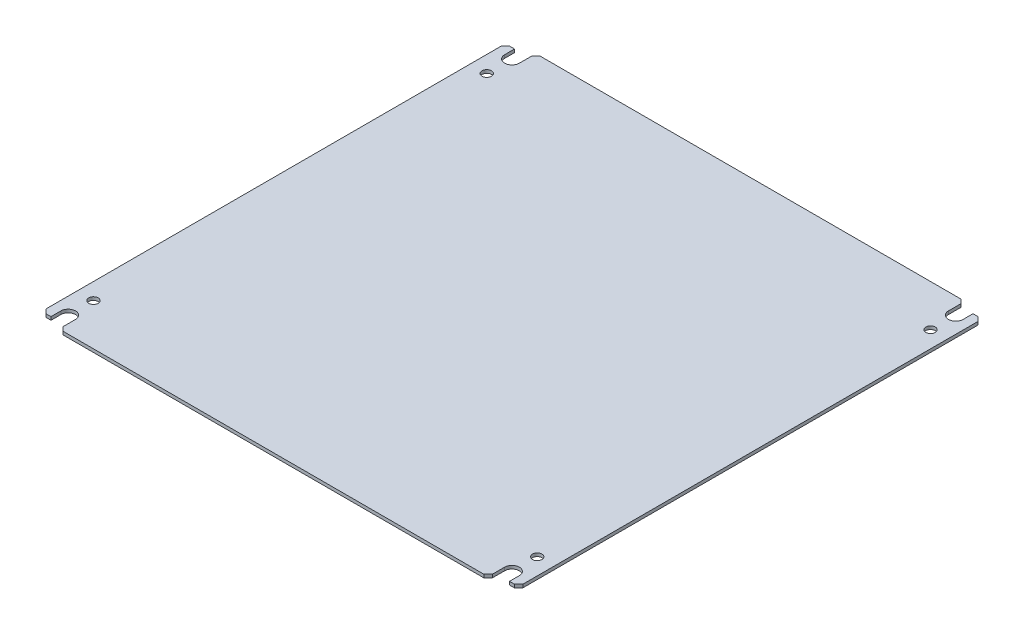
ISO-10303-21;
HEADER;
FILE_DESCRIPTION(('STEP AP214'),'2;1');
FILE_NAME('part.step','',(''),(''),'','','');
FILE_SCHEMA(('AUTOMOTIVE_DESIGN { 1 0 10303 214 1 1 1 1 }'));
ENDSEC;
DATA;
#1=APPLICATION_CONTEXT('core data for automotive mechanical design processes');
#2=APPLICATION_PROTOCOL_DEFINITION('international standard','automotive_design',2000,#1);
#3=PRODUCT_CONTEXT('',#1,'mechanical');
#4=PRODUCT('Part','Part','',(#3));
#5=PRODUCT_RELATED_PRODUCT_CATEGORY('part','',(#4));
#6=PRODUCT_DEFINITION_FORMATION('','',#4);
#7=PRODUCT_DEFINITION_CONTEXT('part definition',#1,'design');
#8=PRODUCT_DEFINITION('design','',#6,#7);
#9=PRODUCT_DEFINITION_SHAPE('','',#8);
#10=(LENGTH_UNIT() NAMED_UNIT(*) SI_UNIT(.MILLI.,.METRE.));
#11=(NAMED_UNIT(*) PLANE_ANGLE_UNIT() SI_UNIT($,.RADIAN.));
#12=(NAMED_UNIT(*) SI_UNIT($,.STERADIAN.) SOLID_ANGLE_UNIT());
#13=UNCERTAINTY_MEASURE_WITH_UNIT(LENGTH_MEASURE(1.E-05),#10,'distance_accuracy_value','');
#14=(GEOMETRIC_REPRESENTATION_CONTEXT(3) GLOBAL_UNCERTAINTY_ASSIGNED_CONTEXT((#13)) GLOBAL_UNIT_ASSIGNED_CONTEXT((#10,
#11,#12)) REPRESENTATION_CONTEXT('',''));
#15=CARTESIAN_POINT('',(0.,0.,0.));
#16=DIRECTION('',(0.,0.,1.));
#17=DIRECTION('',(1.,0.,0.));
#18=AXIS2_PLACEMENT_3D('',#15,#16,#17);
#19=CARTESIAN_POINT('',(-179.959,0.,-179.959));
#20=DIRECTION('',(0.,-1.,0.));
#21=DIRECTION('',(0.,0.,-1.));
#22=AXIS2_PLACEMENT_3D('',#19,#20,#21);
#23=PLANE('',#22);
#24=DIRECTION('',(0.,0.,-1.));
#25=VECTOR('',#24,1.);
#26=CARTESIAN_POINT('',(-173.0375,0.,-167.4876));
#27=LINE('',#26,#25);
#28=CARTESIAN_POINT('',(-173.0375,0.,-167.4876));
#29=VERTEX_POINT('',#28);
#30=CARTESIAN_POINT('',(-173.0375,0.,-174.9552));
#31=VERTEX_POINT('',#30);
#32=EDGE_CURVE('E274',#29,#31,#27,.T.);
#33=ORIENTED_EDGE('',*,*,#32,.F.);
#34=CARTESIAN_POINT('',(-167.4876,0.,-167.4876));
#35=DIRECTION('',(0.,1.,0.));
#36=DIRECTION('',(0.,0.,1.));
#37=AXIS2_PLACEMENT_3D('',#34,#35,#36);
#38=CIRCLE('',#37,5.5499);
#39=CARTESIAN_POINT('',(-161.9377,0.,-167.4876));
#40=VERTEX_POINT('',#39);
#41=EDGE_CURVE('E264',#29,#40,#38,.T.);
#42=ORIENTED_EDGE('',*,*,#41,.T.);
#43=DIRECTION('',(0.,0.,1.));
#44=VECTOR('',#43,1.);
#45=CARTESIAN_POINT('',(-161.9377,0.,-167.4876));
#46=LINE('',#45,#44);
#47=CARTESIAN_POINT('',(-161.9377,0.,-176.784));
#48=VERTEX_POINT('',#47);
#49=EDGE_CURVE('E261',#48,#40,#46,.T.);
#50=ORIENTED_EDGE('',*,*,#49,.F.);
#51=DIRECTION('',(-0.707106781186545,0.,0.70710678118655));
#52=VECTOR('',#51,1.);
#53=CARTESIAN_POINT('',(-161.9377,0.,-176.784));
#54=LINE('',#53,#52);
#55=CARTESIAN_POINT('',(-158.7627,0.,-179.959));
#56=VERTEX_POINT('',#55);
#57=EDGE_CURVE('E267',#56,#48,#54,.T.);
#58=ORIENTED_EDGE('',*,*,#57,.F.);
#59=DIRECTION('',(1.,0.,0.));
#60=VECTOR('',#59,1.);
#61=CARTESIAN_POINT('',(179.959,0.,-179.959));
#62=LINE('',#61,#60);
#63=CARTESIAN_POINT('',(158.7627,0.,-179.959));
#64=VERTEX_POINT('',#63);
#65=EDGE_CURVE('E255',#56,#64,#62,.T.);
#66=ORIENTED_EDGE('',*,*,#65,.T.);
#67=DIRECTION('',(-0.707106781186545,0.,-0.70710678118655));
#68=VECTOR('',#67,1.);
#69=CARTESIAN_POINT('',(158.7627,0.,-179.959));
#70=LINE('',#69,#68);
#71=CARTESIAN_POINT('',(161.9377,0.,-176.784));
#72=VERTEX_POINT('',#71);
#73=EDGE_CURVE('E250',#72,#64,#70,.T.);
#74=ORIENTED_EDGE('',*,*,#73,.F.);
#75=DIRECTION('',(0.,0.,-1.));
#76=VECTOR('',#75,1.);
#77=CARTESIAN_POINT('',(161.9377,0.,-179.959));
#78=LINE('',#77,#76);
#79=CARTESIAN_POINT('',(161.9377,0.,-167.4876));
#80=VERTEX_POINT('',#79);
#81=EDGE_CURVE('E198',#80,#72,#78,.T.);
#82=ORIENTED_EDGE('',*,*,#81,.F.);
#83=CARTESIAN_POINT('',(167.4876,0.,-167.4876));
#84=DIRECTION('',(0.,1.,0.));
#85=DIRECTION('',(0.,0.,1.));
#86=AXIS2_PLACEMENT_3D('',#83,#84,#85);
#87=CIRCLE('',#86,5.5499);
#88=CARTESIAN_POINT('',(173.0375,0.,-167.4876));
#89=VERTEX_POINT('',#88);
#90=EDGE_CURVE('E212',#80,#89,#87,.T.);
#91=ORIENTED_EDGE('',*,*,#90,.T.);
#92=DIRECTION('',(0.,0.,1.));
#93=VECTOR('',#92,1.);
#94=CARTESIAN_POINT('',(173.0375,0.,-167.4876));
#95=LINE('',#94,#93);
#96=CARTESIAN_POINT('',(173.0375,0.,-174.9552));
#97=VERTEX_POINT('',#96);
#98=EDGE_CURVE('E204',#97,#89,#95,.T.);
#99=ORIENTED_EDGE('',*,*,#98,.F.);
#100=DIRECTION('',(-1.,0.,0.));
#101=VECTOR('',#100,1.);
#102=CARTESIAN_POINT('',(173.0375,0.,-174.9552));
#103=LINE('',#102,#101);
#104=CARTESIAN_POINT('',(176.784,-2.59052039079203E-13,-174.9552));
#105=VERTEX_POINT('',#104);
#106=EDGE_CURVE('E223',#105,#97,#103,.T.);
#107=ORIENTED_EDGE('',*,*,#106,.F.);
#108=DIRECTION('',(-0.707106781186548,0.,-0.707106781186548));
#109=VECTOR('',#108,1.);
#110=CARTESIAN_POINT('',(176.784,-2.22044604925031E-13,-174.9552));
#111=LINE('',#110,#109);
#112=CARTESIAN_POINT('',(179.959,0.,-171.7802));
#113=VERTEX_POINT('',#112);
#114=EDGE_CURVE('E359',#113,#105,#111,.T.);
#115=ORIENTED_EDGE('',*,*,#114,.F.);
#116=DIRECTION('',(0.,0.,1.));
#117=VECTOR('',#116,1.);
#118=CARTESIAN_POINT('',(179.959,0.,179.959));
#119=LINE('',#118,#117);
#120=CARTESIAN_POINT('',(179.959,0.,171.7802));
#121=VERTEX_POINT('',#120);
#122=EDGE_CURVE('E351',#113,#121,#119,.T.);
#123=ORIENTED_EDGE('',*,*,#122,.T.);
#124=DIRECTION('',(0.707106781186548,0.,-0.707106781186548));
#125=VECTOR('',#124,1.);
#126=CARTESIAN_POINT('',(179.959,0.,171.7802));
#127=LINE('',#126,#125);
#128=CARTESIAN_POINT('',(176.784,0.,174.9552));
#129=VERTEX_POINT('',#128);
#130=EDGE_CURVE('E349',#129,#121,#127,.T.);
#131=ORIENTED_EDGE('',*,*,#130,.F.);
#132=DIRECTION('',(1.,0.,0.));
#133=VECTOR('',#132,1.);
#134=CARTESIAN_POINT('',(179.959,0.,174.9552));
#135=LINE('',#134,#133);
#136=CARTESIAN_POINT('',(173.0375,0.,174.9552));
#137=VERTEX_POINT('',#136);
#138=EDGE_CURVE('E344',#137,#129,#135,.T.);
#139=ORIENTED_EDGE('',*,*,#138,.F.);
#140=DIRECTION('',(0.,0.,1.));
#141=VECTOR('',#140,1.);
#142=CARTESIAN_POINT('',(173.0375,0.,174.9552));
#143=LINE('',#142,#141);
#144=CARTESIAN_POINT('',(173.0375,0.,167.4876));
#145=VERTEX_POINT('',#144);
#146=EDGE_CURVE('E338',#145,#137,#143,.T.);
#147=ORIENTED_EDGE('',*,*,#146,.F.);
#148=CARTESIAN_POINT('',(167.4876,0.,167.4876));
#149=DIRECTION('',(0.,1.,0.));
#150=DIRECTION('',(0.,0.,1.));
#151=AXIS2_PLACEMENT_3D('',#148,#149,#150);
#152=CIRCLE('',#151,5.5499);
#153=CARTESIAN_POINT('',(161.9377,0.,167.4876));
#154=VERTEX_POINT('',#153);
#155=EDGE_CURVE('E335',#145,#154,#152,.T.);
#156=ORIENTED_EDGE('',*,*,#155,.T.);
#157=DIRECTION('',(0.,0.,-1.));
#158=VECTOR('',#157,1.);
#159=CARTESIAN_POINT('',(161.9377,0.,167.4876));
#160=LINE('',#159,#158);
#161=CARTESIAN_POINT('',(161.9377,0.,176.784));
#162=VERTEX_POINT('',#161);
#163=EDGE_CURVE('E333',#162,#154,#160,.T.);
#164=ORIENTED_EDGE('',*,*,#163,.F.);
#165=DIRECTION('',(0.707106781186545,0.,-0.70710678118655));
#166=VECTOR('',#165,1.);
#167=CARTESIAN_POINT('',(161.9377,0.,176.784));
#168=LINE('',#167,#166);
#169=CARTESIAN_POINT('',(158.7627,0.,179.959));
#170=VERTEX_POINT('',#169);
#171=EDGE_CURVE('E327',#170,#162,#168,.T.);
#172=ORIENTED_EDGE('',*,*,#171,.F.);
#173=DIRECTION('',(-1.,0.,0.));
#174=VECTOR('',#173,1.);
#175=CARTESIAN_POINT('',(-179.959,0.,179.959));
#176=LINE('',#175,#174);
#177=CARTESIAN_POINT('',(-158.7627,0.,179.959));
#178=VERTEX_POINT('',#177);
#179=EDGE_CURVE('E319',#170,#178,#176,.T.);
#180=ORIENTED_EDGE('',*,*,#179,.T.);
#181=DIRECTION('',(0.707106781186545,0.,0.70710678118655));
#182=VECTOR('',#181,1.);
#183=CARTESIAN_POINT('',(-158.7627,0.,179.959));
#184=LINE('',#183,#182);
#185=CARTESIAN_POINT('',(-161.9377,0.,176.784));
#186=VERTEX_POINT('',#185);
#187=EDGE_CURVE('E317',#186,#178,#184,.T.);
#188=ORIENTED_EDGE('',*,*,#187,.F.);
#189=DIRECTION('',(0.,0.,1.));
#190=VECTOR('',#189,1.);
#191=CARTESIAN_POINT('',(-161.9377,0.,179.959));
#192=LINE('',#191,#190);
#193=CARTESIAN_POINT('',(-161.9377,0.,167.4876));
#194=VERTEX_POINT('',#193);
#195=EDGE_CURVE('E311',#194,#186,#192,.T.);
#196=ORIENTED_EDGE('',*,*,#195,.F.);
#197=CARTESIAN_POINT('',(-167.4876,0.,167.4876));
#198=DIRECTION('',(0.,1.,0.));
#199=DIRECTION('',(0.,0.,1.));
#200=AXIS2_PLACEMENT_3D('',#197,#198,#199);
#201=CIRCLE('',#200,5.5499);
#202=CARTESIAN_POINT('',(-173.0375,0.,167.4876));
#203=VERTEX_POINT('',#202);
#204=EDGE_CURVE('E308',#194,#203,#201,.T.);
#205=ORIENTED_EDGE('',*,*,#204,.T.);
#206=DIRECTION('',(0.,0.,-1.));
#207=VECTOR('',#206,1.);
#208=CARTESIAN_POINT('',(-173.0375,0.,167.4876));
#209=LINE('',#208,#207);
#210=CARTESIAN_POINT('',(-173.0375,0.,174.9552));
#211=VERTEX_POINT('',#210);
#212=EDGE_CURVE('E306',#211,#203,#209,.T.);
#213=ORIENTED_EDGE('',*,*,#212,.F.);
#214=DIRECTION('',(1.,0.,0.));
#215=VECTOR('',#214,1.);
#216=CARTESIAN_POINT('',(-173.0375,0.,174.9552));
#217=LINE('',#216,#215);
#218=CARTESIAN_POINT('',(-176.784,-2.59052039079203E-13,174.9552));
#219=VERTEX_POINT('',#218);
#220=EDGE_CURVE('E301',#219,#211,#217,.T.);
#221=ORIENTED_EDGE('',*,*,#220,.F.);
#222=DIRECTION('',(0.707106781186548,0.,0.707106781186548));
#223=VECTOR('',#222,1.);
#224=CARTESIAN_POINT('',(-176.784,-2.22044604925031E-13,174.9552));
#225=LINE('',#224,#223);
#226=CARTESIAN_POINT('',(-179.959,0.,171.7802));
#227=VERTEX_POINT('',#226);
#228=EDGE_CURVE('E295',#227,#219,#225,.T.);
#229=ORIENTED_EDGE('',*,*,#228,.F.);
#230=DIRECTION('',(0.,0.,-1.));
#231=VECTOR('',#230,1.);
#232=CARTESIAN_POINT('',(-179.959,0.,-179.959));
#233=LINE('',#232,#231);
#234=CARTESIAN_POINT('',(-179.959,0.,-171.7802));
#235=VERTEX_POINT('',#234);
#236=EDGE_CURVE('E287',#227,#235,#233,.T.);
#237=ORIENTED_EDGE('',*,*,#236,.T.);
#238=DIRECTION('',(-0.707106781186548,0.,0.707106781186548));
#239=VECTOR('',#238,1.);
#240=CARTESIAN_POINT('',(-179.959,0.,-171.7802));
#241=LINE('',#240,#239);
#242=CARTESIAN_POINT('',(-176.784,0.,-174.9552));
#243=VERTEX_POINT('',#242);
#244=EDGE_CURVE('E285',#243,#235,#241,.T.);
#245=ORIENTED_EDGE('',*,*,#244,.F.);
#246=DIRECTION('',(-1.,0.,0.));
#247=VECTOR('',#246,1.);
#248=CARTESIAN_POINT('',(-173.0375,0.,-174.9552));
#249=LINE('',#248,#247);
#250=EDGE_CURVE('E280',#31,#243,#249,.T.);
#251=ORIENTED_EDGE('',*,*,#250,.F.);
#252=EDGE_LOOP('',(#33,#42,#50,#58,#66,#74,#82,#91,#99,#107,#115,#123,#131,#139,#147,#156,#164,
#172,#180,#188,#196,#205,#213,#221,#229,#237,#245,#251));
#253=FACE_BOUND('',#252,.T.);
#254=CARTESIAN_POINT('',(-167.4876,0.,148.4376));
#255=DIRECTION('',(0.,-1.,0.));
#256=DIRECTION('',(0.,0.,-1.));
#257=AXIS2_PLACEMENT_3D('',#254,#255,#256);
#258=CIRCLE('',#257,3.5687);
#259=CARTESIAN_POINT('',(-167.4876,0.,144.8689));
#260=VERTEX_POINT('',#259);
#261=EDGE_CURVE('E252',#260,#260,#258,.F.);
#262=ORIENTED_EDGE('',*,*,#261,.T.);
#263=EDGE_LOOP('',(#262));
#264=FACE_BOUND('',#263,.T.);
#265=CARTESIAN_POINT('',(-167.4876,0.,-148.4376));
#266=DIRECTION('',(0.,-1.,0.));
#267=DIRECTION('',(0.,0.,-1.));
#268=AXIS2_PLACEMENT_3D('',#265,#266,#267);
#269=CIRCLE('',#268,3.5687);
#270=CARTESIAN_POINT('',(-167.4876,0.,-152.0063));
#271=VERTEX_POINT('',#270);
#272=EDGE_CURVE('E409',#271,#271,#269,.F.);
#273=ORIENTED_EDGE('',*,*,#272,.T.);
#274=EDGE_LOOP('',(#273));
#275=FACE_BOUND('',#274,.T.);
#276=CARTESIAN_POINT('',(167.4876,0.,-148.4376));
#277=DIRECTION('',(0.,-1.,0.));
#278=DIRECTION('',(0.,0.,-1.));
#279=AXIS2_PLACEMENT_3D('',#276,#277,#278);
#280=CIRCLE('',#279,3.5687);
#281=CARTESIAN_POINT('',(167.4876,0.,-152.0063));
#282=VERTEX_POINT('',#281);
#283=EDGE_CURVE('E411',#282,#282,#280,.F.);
#284=ORIENTED_EDGE('',*,*,#283,.T.);
#285=EDGE_LOOP('',(#284));
#286=FACE_BOUND('',#285,.T.);
#287=CARTESIAN_POINT('',(167.4876,0.,148.4376));
#288=DIRECTION('',(0.,-1.,0.));
#289=DIRECTION('',(0.,0.,-1.));
#290=AXIS2_PLACEMENT_3D('',#287,#288,#289);
#291=CIRCLE('',#290,3.5687);
#292=CARTESIAN_POINT('',(167.4876,0.,144.8689));
#293=VERTEX_POINT('',#292);
#294=EDGE_CURVE('E19',#293,#293,#291,.F.);
#295=ORIENTED_EDGE('',*,*,#294,.T.);
#296=EDGE_LOOP('',(#295));
#297=FACE_BOUND('',#296,.T.);
#298=ADVANCED_FACE('F16',(#253,#264,#275,#286,#297),#23,.T.);
#299=CARTESIAN_POINT('',(167.4876,0.,148.4376));
#300=DIRECTION('',(0.,-1.,0.));
#301=DIRECTION('',(0.,0.,-1.));
#302=AXIS2_PLACEMENT_3D('',#299,#300,#301);
#303=CYLINDRICAL_SURFACE('',#302,3.5687);
#304=CARTESIAN_POINT('',(167.4876,2.413,148.4376));
#305=DIRECTION('',(0.,-1.,0.));
#306=DIRECTION('',(0.,0.,-1.));
#307=AXIS2_PLACEMENT_3D('',#304,#305,#306);
#308=CIRCLE('',#307,3.5687);
#309=CARTESIAN_POINT('',(167.4876,2.413,144.8689));
#310=VERTEX_POINT('',#309);
#311=EDGE_CURVE('E258',#310,#310,#308,.F.);
#312=ORIENTED_EDGE('',*,*,#311,.T.);
#313=EDGE_LOOP('',(#312));
#314=FACE_BOUND('',#313,.T.);
#315=ORIENTED_EDGE('',*,*,#294,.F.);
#316=EDGE_LOOP('',(#315));
#317=FACE_BOUND('',#316,.T.);
#318=ADVANCED_FACE('F419',(#314,#317),#303,.F.);
#319=CARTESIAN_POINT('',(167.4876,0.,-148.4376));
#320=DIRECTION('',(0.,-1.,0.));
#321=DIRECTION('',(0.,0.,-1.));
#322=AXIS2_PLACEMENT_3D('',#319,#320,#321);
#323=CYLINDRICAL_SURFACE('',#322,3.5687);
#324=CARTESIAN_POINT('',(167.4876,2.413,-148.4376));
#325=DIRECTION('',(0.,-1.,0.));
#326=DIRECTION('',(0.,0.,-1.));
#327=AXIS2_PLACEMENT_3D('',#324,#325,#326);
#328=CIRCLE('',#327,3.5687);
#329=CARTESIAN_POINT('',(167.4876,2.413,-152.0063));
#330=VERTEX_POINT('',#329);
#331=EDGE_CURVE('E393',#330,#330,#328,.F.);
#332=ORIENTED_EDGE('',*,*,#331,.T.);
#333=EDGE_LOOP('',(#332));
#334=FACE_BOUND('',#333,.T.);
#335=ORIENTED_EDGE('',*,*,#283,.F.);
#336=EDGE_LOOP('',(#335));
#337=FACE_BOUND('',#336,.T.);
#338=ADVANCED_FACE('F421',(#334,#337),#323,.F.);
#339=CARTESIAN_POINT('',(-167.4876,0.,-148.4376));
#340=DIRECTION('',(0.,-1.,0.));
#341=DIRECTION('',(0.,0.,-1.));
#342=AXIS2_PLACEMENT_3D('',#339,#340,#341);
#343=CYLINDRICAL_SURFACE('',#342,3.5687);
#344=CARTESIAN_POINT('',(-167.4876,2.413,-148.4376));
#345=DIRECTION('',(0.,-1.,0.));
#346=DIRECTION('',(0.,0.,-1.));
#347=AXIS2_PLACEMENT_3D('',#344,#345,#346);
#348=CIRCLE('',#347,3.5687);
#349=CARTESIAN_POINT('',(-167.4876,2.413,-152.0063));
#350=VERTEX_POINT('',#349);
#351=EDGE_CURVE('E390',#350,#350,#348,.F.);
#352=ORIENTED_EDGE('',*,*,#351,.T.);
#353=EDGE_LOOP('',(#352));
#354=FACE_BOUND('',#353,.T.);
#355=ORIENTED_EDGE('',*,*,#272,.F.);
#356=EDGE_LOOP('',(#355));
#357=FACE_BOUND('',#356,.T.);
#358=ADVANCED_FACE('F428',(#354,#357),#343,.F.);
#359=CARTESIAN_POINT('',(-167.4876,0.,148.4376));
#360=DIRECTION('',(0.,-1.,0.));
#361=DIRECTION('',(0.,0.,-1.));
#362=AXIS2_PLACEMENT_3D('',#359,#360,#361);
#363=CYLINDRICAL_SURFACE('',#362,3.5687);
#364=CARTESIAN_POINT('',(-167.4876,2.413,148.4376));
#365=DIRECTION('',(0.,-1.,0.));
#366=DIRECTION('',(0.,0.,-1.));
#367=AXIS2_PLACEMENT_3D('',#364,#365,#366);
#368=CIRCLE('',#367,3.5687);
#369=CARTESIAN_POINT('',(-167.4876,2.413,144.8689));
#370=VERTEX_POINT('',#369);
#371=EDGE_CURVE('E239',#370,#370,#368,.F.);
#372=ORIENTED_EDGE('',*,*,#371,.T.);
#373=EDGE_LOOP('',(#372));
#374=FACE_BOUND('',#373,.T.);
#375=ORIENTED_EDGE('',*,*,#261,.F.);
#376=EDGE_LOOP('',(#375));
#377=FACE_BOUND('',#376,.T.);
#378=ADVANCED_FACE('F546',(#374,#377),#363,.F.);
#379=CARTESIAN_POINT('',(158.7627,2.413,-179.959));
#380=DIRECTION('',(0.70710678118655,0.,-0.707106781186545));
#381=DIRECTION('',(-0.707106781186545,0.,-0.70710678118655));
#382=AXIS2_PLACEMENT_3D('',#379,#380,#381);
#383=PLANE('',#382);
#384=ORIENTED_EDGE('',*,*,#73,.T.);
#385=DIRECTION('',(0.,1.,0.));
#386=VECTOR('',#385,1.);
#387=CARTESIAN_POINT('',(158.7627,2.413,-179.959));
#388=LINE('',#387,#386);
#389=CARTESIAN_POINT('',(158.7627,2.413,-179.959));
#390=VERTEX_POINT('',#389);
#391=EDGE_CURVE('E242',#64,#390,#388,.T.);
#392=ORIENTED_EDGE('',*,*,#391,.T.);
#393=DIRECTION('',(0.707106781186551,0.,0.707106781186544));
#394=VECTOR('',#393,1.);
#395=CARTESIAN_POINT('',(158.7627,2.413,-179.959));
#396=LINE('',#395,#394);
#397=CARTESIAN_POINT('',(161.9377,2.413,-176.784));
#398=VERTEX_POINT('',#397);
#399=EDGE_CURVE('E235',#390,#398,#396,.T.);
#400=ORIENTED_EDGE('',*,*,#399,.T.);
#401=DIRECTION('',(0.,1.,0.));
#402=VECTOR('',#401,1.);
#403=CARTESIAN_POINT('',(161.9377,509.006636515675,-176.784));
#404=LINE('',#403,#402);
#405=EDGE_CURVE('E231',#72,#398,#404,.T.);
#406=ORIENTED_EDGE('',*,*,#405,.F.);
#407=EDGE_LOOP('',(#384,#392,#400,#406));
#408=FACE_BOUND('',#407,.T.);
#409=ADVANCED_FACE('F542',(#408),#383,.T.);
#410=CARTESIAN_POINT('',(161.9377,509.006636515675,-179.959));
#411=DIRECTION('',(1.,0.,0.));
#412=DIRECTION('',(0.,0.,-1.));
#413=AXIS2_PLACEMENT_3D('',#410,#411,#412);
#414=PLANE('',#413);
#415=DIRECTION('',(0.,0.,-1.));
#416=VECTOR('',#415,1.);
#417=CARTESIAN_POINT('',(161.9377,2.413,-179.959));
#418=LINE('',#417,#416);
#419=CARTESIAN_POINT('',(161.9377,2.413,-167.4876));
#420=VERTEX_POINT('',#419);
#421=EDGE_CURVE('E238',#398,#420,#418,.F.);
#422=ORIENTED_EDGE('',*,*,#421,.T.);
#423=DIRECTION('',(0.,1.,0.));
#424=VECTOR('',#423,1.);
#425=CARTESIAN_POINT('',(161.9377,509.006636515675,-167.4876));
#426=LINE('',#425,#424);
#427=EDGE_CURVE('E217',#420,#80,#426,.F.);
#428=ORIENTED_EDGE('',*,*,#427,.T.);
#429=ORIENTED_EDGE('',*,*,#81,.T.);
#430=ORIENTED_EDGE('',*,*,#405,.T.);
#431=EDGE_LOOP('',(#422,#428,#429,#430));
#432=FACE_BOUND('',#431,.T.);
#433=ADVANCED_FACE('F539',(#432),#414,.T.);
#434=CARTESIAN_POINT('',(167.4876,509.006636515675,-167.4876));
#435=DIRECTION('',(0.,1.,0.));
#436=DIRECTION('',(0.,0.,1.));
#437=AXIS2_PLACEMENT_3D('',#434,#435,#436);
#438=CYLINDRICAL_SURFACE('',#437,5.5499);
#439=DIRECTION('',(0.,1.,0.));
#440=VECTOR('',#439,1.);
#441=CARTESIAN_POINT('',(173.0375,509.006636515675,-167.4876));
#442=LINE('',#441,#440);
#443=CARTESIAN_POINT('',(173.0375,2.413,-167.4876));
#444=VERTEX_POINT('',#443);
#445=EDGE_CURVE('E208',#89,#444,#442,.T.);
#446=ORIENTED_EDGE('',*,*,#445,.F.);
#447=ORIENTED_EDGE('',*,*,#90,.F.);
#448=ORIENTED_EDGE('',*,*,#427,.F.);
#449=CARTESIAN_POINT('',(167.4876,2.413,-167.4876));
#450=DIRECTION('',(0.,1.,0.));
#451=DIRECTION('',(0.,0.,1.));
#452=AXIS2_PLACEMENT_3D('',#449,#450,#451);
#453=CIRCLE('',#452,5.5499);
#454=EDGE_CURVE('E222',#420,#444,#453,.T.);
#455=ORIENTED_EDGE('',*,*,#454,.T.);
#456=EDGE_LOOP('',(#446,#447,#448,#455));
#457=FACE_BOUND('',#456,.T.);
#458=ADVANCED_FACE('F220',(#457),#438,.F.);
#459=CARTESIAN_POINT('',(173.0375,509.006636515675,-167.4876));
#460=DIRECTION('',(-1.,0.,0.));
#461=DIRECTION('',(0.,0.,1.));
#462=AXIS2_PLACEMENT_3D('',#459,#460,#461);
#463=PLANE('',#462);
#464=ORIENTED_EDGE('',*,*,#98,.T.);
#465=ORIENTED_EDGE('',*,*,#445,.T.);
#466=DIRECTION('',(0.,0.,-1.));
#467=VECTOR('',#466,1.);
#468=CARTESIAN_POINT('',(173.0375,2.413,-179.959));
#469=LINE('',#468,#467);
#470=CARTESIAN_POINT('',(173.0375,2.413,-174.9552));
#471=VERTEX_POINT('',#470);
#472=EDGE_CURVE('E387',#444,#471,#469,.T.);
#473=ORIENTED_EDGE('',*,*,#472,.T.);
#474=DIRECTION('',(0.,1.,0.));
#475=VECTOR('',#474,1.);
#476=CARTESIAN_POINT('',(173.0375,509.006636515675,-174.9552));
#477=LINE('',#476,#475);
#478=EDGE_CURVE('E210',#97,#471,#477,.T.);
#479=ORIENTED_EDGE('',*,*,#478,.F.);
#480=EDGE_LOOP('',(#464,#465,#473,#479));
#481=FACE_BOUND('',#480,.T.);
#482=ADVANCED_FACE('F205',(#481),#463,.T.);
#483=CARTESIAN_POINT('',(173.0375,509.006636515675,-174.9552));
#484=DIRECTION('',(0.,0.,-1.));
#485=DIRECTION('',(-1.,0.,0.));
#486=AXIS2_PLACEMENT_3D('',#483,#484,#485);
#487=PLANE('',#486);
#488=ORIENTED_EDGE('',*,*,#106,.T.);
#489=ORIENTED_EDGE('',*,*,#478,.T.);
#490=DIRECTION('',(1.,0.,0.));
#491=VECTOR('',#490,1.);
#492=CARTESIAN_POINT('',(-179.959,2.413,-174.9552));
#493=LINE('',#492,#491);
#494=CARTESIAN_POINT('',(176.784,2.41299999999993,-174.9552));
#495=VERTEX_POINT('',#494);
#496=EDGE_CURVE('E901',#471,#495,#493,.T.);
#497=ORIENTED_EDGE('',*,*,#496,.T.);
#498=DIRECTION('',(0.,1.,0.));
#499=VECTOR('',#498,1.);
#500=CARTESIAN_POINT('',(176.784,509.006636515675,-174.9552));
#501=LINE('',#500,#499);
#502=EDGE_CURVE('E361',#105,#495,#501,.T.);
#503=ORIENTED_EDGE('',*,*,#502,.F.);
#504=EDGE_LOOP('',(#488,#489,#497,#503));
#505=FACE_BOUND('',#504,.T.);
#506=ADVANCED_FACE('F530',(#505),#487,.T.);
#507=CARTESIAN_POINT('',(176.784,509.006636515675,-174.9552));
#508=DIRECTION('',(0.707106781186548,0.,-0.707106781186548));
#509=DIRECTION('',(-0.707106781186548,0.,-0.707106781186548));
#510=AXIS2_PLACEMENT_3D('',#507,#508,#509);
#511=PLANE('',#510);
#512=ORIENTED_EDGE('',*,*,#114,.T.);
#513=ORIENTED_EDGE('',*,*,#502,.T.);
#514=DIRECTION('',(0.707106781186548,0.,0.707106781186548));
#515=VECTOR('',#514,1.);
#516=CARTESIAN_POINT('',(176.784,2.413,-174.9552));
#517=LINE('',#516,#515);
#518=CARTESIAN_POINT('',(179.959,2.413,-171.7802));
#519=VERTEX_POINT('',#518);
#520=EDGE_CURVE('E892',#495,#519,#517,.T.);
#521=ORIENTED_EDGE('',*,*,#520,.T.);
#522=DIRECTION('',(0.,1.,0.));
#523=VECTOR('',#522,1.);
#524=CARTESIAN_POINT('',(179.959,2.413,-171.7802));
#525=LINE('',#524,#523);
#526=EDGE_CURVE('E356',#519,#113,#525,.F.);
#527=ORIENTED_EDGE('',*,*,#526,.T.);
#528=EDGE_LOOP('',(#512,#513,#521,#527));
#529=FACE_BOUND('',#528,.T.);
#530=ADVANCED_FACE('F526',(#529),#511,.T.);
#531=CARTESIAN_POINT('',(179.959,2.413,179.959));
#532=DIRECTION('',(-1.,0.,0.));
#533=DIRECTION('',(0.,0.,1.));
#534=AXIS2_PLACEMENT_3D('',#531,#532,#533);
#535=PLANE('',#534);
#536=ORIENTED_EDGE('',*,*,#526,.F.);
#537=DIRECTION('',(0.,0.,-1.));
#538=VECTOR('',#537,1.);
#539=CARTESIAN_POINT('',(179.959,2.413,-179.959));
#540=LINE('',#539,#538);
#541=CARTESIAN_POINT('',(179.959,2.413,171.7802));
#542=VERTEX_POINT('',#541);
#543=EDGE_CURVE('E884',#519,#542,#540,.F.);
#544=ORIENTED_EDGE('',*,*,#543,.T.);
#545=DIRECTION('',(0.,1.,0.));
#546=VECTOR('',#545,1.);
#547=CARTESIAN_POINT('',(179.959,2.413,171.7802));
#548=LINE('',#547,#546);
#549=EDGE_CURVE('E346',#121,#542,#548,.T.);
#550=ORIENTED_EDGE('',*,*,#549,.F.);
#551=ORIENTED_EDGE('',*,*,#122,.F.);
#552=EDGE_LOOP('',(#536,#544,#550,#551));
#553=FACE_BOUND('',#552,.T.);
#554=ADVANCED_FACE('F522',(#553),#535,.F.);
#555=CARTESIAN_POINT('',(179.959,2.413,171.7802));
#556=DIRECTION('',(0.707106781186548,0.,0.707106781186548));
#557=DIRECTION('',(0.707106781186548,0.,-0.707106781186548));
#558=AXIS2_PLACEMENT_3D('',#555,#556,#557);
#559=PLANE('',#558);
#560=ORIENTED_EDGE('',*,*,#130,.T.);
#561=ORIENTED_EDGE('',*,*,#549,.T.);
#562=DIRECTION('',(-0.707106781186548,0.,0.707106781186548));
#563=VECTOR('',#562,1.);
#564=CARTESIAN_POINT('',(179.959,2.413,171.7802));
#565=LINE('',#564,#563);
#566=CARTESIAN_POINT('',(176.784,2.413,174.9552));
#567=VERTEX_POINT('',#566);
#568=EDGE_CURVE('E876',#542,#567,#565,.T.);
#569=ORIENTED_EDGE('',*,*,#568,.T.);
#570=DIRECTION('',(0.,1.,0.));
#571=VECTOR('',#570,1.);
#572=CARTESIAN_POINT('',(176.784,509.006636515675,174.9552));
#573=LINE('',#572,#571);
#574=EDGE_CURVE('E341',#129,#567,#573,.T.);
#575=ORIENTED_EDGE('',*,*,#574,.F.);
#576=EDGE_LOOP('',(#560,#561,#569,#575));
#577=FACE_BOUND('',#576,.T.);
#578=ADVANCED_FACE('F518',(#577),#559,.T.);
#579=CARTESIAN_POINT('',(179.959,509.006636515675,174.9552));
#580=DIRECTION('',(0.,0.,1.));
#581=DIRECTION('',(1.,0.,0.));
#582=AXIS2_PLACEMENT_3D('',#579,#580,#581);
#583=PLANE('',#582);
#584=DIRECTION('',(1.,0.,0.));
#585=VECTOR('',#584,1.);
#586=CARTESIAN_POINT('',(-179.959,2.413,174.9552));
#587=LINE('',#586,#585);
#588=CARTESIAN_POINT('',(173.0375,2.413,174.9552));
#589=VERTEX_POINT('',#588);
#590=EDGE_CURVE('E873',#567,#589,#587,.F.);
#591=ORIENTED_EDGE('',*,*,#590,.T.);
#592=DIRECTION('',(0.,1.,0.));
#593=VECTOR('',#592,1.);
#594=CARTESIAN_POINT('',(173.0375,509.006636515675,174.9552));
#595=LINE('',#594,#593);
#596=EDGE_CURVE('E340',#137,#589,#595,.T.);
#597=ORIENTED_EDGE('',*,*,#596,.F.);
#598=ORIENTED_EDGE('',*,*,#138,.T.);
#599=ORIENTED_EDGE('',*,*,#574,.T.);
#600=EDGE_LOOP('',(#591,#597,#598,#599));
#601=FACE_BOUND('',#600,.T.);
#602=ADVANCED_FACE('F514',(#601),#583,.T.);
#603=CARTESIAN_POINT('',(173.0375,509.006636515675,174.9552));
#604=DIRECTION('',(-1.,0.,0.));
#605=DIRECTION('',(0.,0.,1.));
#606=AXIS2_PLACEMENT_3D('',#603,#604,#605);
#607=PLANE('',#606);
#608=ORIENTED_EDGE('',*,*,#146,.T.);
#609=ORIENTED_EDGE('',*,*,#596,.T.);
#610=DIRECTION('',(0.,0.,-1.));
#611=VECTOR('',#610,1.);
#612=CARTESIAN_POINT('',(173.0375,2.413,-179.959));
#613=LINE('',#612,#611);
#614=CARTESIAN_POINT('',(173.0375,2.413,167.4876));
#615=VERTEX_POINT('',#614);
#616=EDGE_CURVE('E385',#589,#615,#613,.T.);
#617=ORIENTED_EDGE('',*,*,#616,.T.);
#618=DIRECTION('',(0.,1.,0.));
#619=VECTOR('',#618,1.);
#620=CARTESIAN_POINT('',(173.0375,509.006636515675,167.4876));
#621=LINE('',#620,#619);
#622=EDGE_CURVE('E405',#615,#145,#621,.F.);
#623=ORIENTED_EDGE('',*,*,#622,.T.);
#624=EDGE_LOOP('',(#608,#609,#617,#623));
#625=FACE_BOUND('',#624,.T.);
#626=ADVANCED_FACE('F510',(#625),#607,.T.);
#627=CARTESIAN_POINT('',(167.4876,509.006636515675,167.4876));
#628=DIRECTION('',(0.,1.,0.));
#629=DIRECTION('',(0.,0.,1.));
#630=AXIS2_PLACEMENT_3D('',#627,#628,#629);
#631=CYLINDRICAL_SURFACE('',#630,5.5499);
#632=DIRECTION('',(0.,1.,0.));
#633=VECTOR('',#632,1.);
#634=CARTESIAN_POINT('',(161.9377,509.006636515675,167.4876));
#635=LINE('',#634,#633);
#636=CARTESIAN_POINT('',(161.9377,2.413,167.4876));
#637=VERTEX_POINT('',#636);
#638=EDGE_CURVE('E330',#154,#637,#635,.T.);
#639=ORIENTED_EDGE('',*,*,#638,.F.);
#640=ORIENTED_EDGE('',*,*,#155,.F.);
#641=ORIENTED_EDGE('',*,*,#622,.F.);
#642=CARTESIAN_POINT('',(167.4876,2.413,167.4876));
#643=DIRECTION('',(0.,1.,0.));
#644=DIRECTION('',(0.,0.,1.));
#645=AXIS2_PLACEMENT_3D('',#642,#643,#644);
#646=CIRCLE('',#645,5.5499);
#647=EDGE_CURVE('E381',#615,#637,#646,.T.);
#648=ORIENTED_EDGE('',*,*,#647,.T.);
#649=EDGE_LOOP('',(#639,#640,#641,#648));
#650=FACE_BOUND('',#649,.T.);
#651=ADVANCED_FACE('F506',(#650),#631,.F.);
#652=CARTESIAN_POINT('',(161.9377,509.006636515675,167.4876));
#653=DIRECTION('',(1.,0.,0.));
#654=DIRECTION('',(0.,0.,-1.));
#655=AXIS2_PLACEMENT_3D('',#652,#653,#654);
#656=PLANE('',#655);
#657=ORIENTED_EDGE('',*,*,#163,.T.);
#658=ORIENTED_EDGE('',*,*,#638,.T.);
#659=DIRECTION('',(0.,0.,-1.));
#660=VECTOR('',#659,1.);
#661=CARTESIAN_POINT('',(161.9377,2.413,-179.959));
#662=LINE('',#661,#660);
#663=CARTESIAN_POINT('',(161.9377,2.413,176.784));
#664=VERTEX_POINT('',#663);
#665=EDGE_CURVE('E384',#637,#664,#662,.F.);
#666=ORIENTED_EDGE('',*,*,#665,.T.);
#667=DIRECTION('',(0.,1.,0.));
#668=VECTOR('',#667,1.);
#669=CARTESIAN_POINT('',(161.9377,509.006636515675,176.784));
#670=LINE('',#669,#668);
#671=EDGE_CURVE('E329',#162,#664,#670,.T.);
#672=ORIENTED_EDGE('',*,*,#671,.F.);
#673=EDGE_LOOP('',(#657,#658,#666,#672));
#674=FACE_BOUND('',#673,.T.);
#675=ADVANCED_FACE('F502',(#674),#656,.T.);
#676=CARTESIAN_POINT('',(161.9377,509.006636515675,176.784));
#677=DIRECTION('',(0.70710678118655,0.,0.707106781186545));
#678=DIRECTION('',(0.707106781186545,0.,-0.70710678118655));
#679=AXIS2_PLACEMENT_3D('',#676,#677,#678);
#680=PLANE('',#679);
#681=ORIENTED_EDGE('',*,*,#171,.T.);
#682=ORIENTED_EDGE('',*,*,#671,.T.);
#683=DIRECTION('',(-0.707106781186554,0.,0.707106781186541));
#684=VECTOR('',#683,1.);
#685=CARTESIAN_POINT('',(161.9377,2.413,176.784));
#686=LINE('',#685,#684);
#687=CARTESIAN_POINT('',(158.7627,2.413,179.959));
#688=VERTEX_POINT('',#687);
#689=EDGE_CURVE('E853',#664,#688,#686,.T.);
#690=ORIENTED_EDGE('',*,*,#689,.T.);
#691=DIRECTION('',(0.,1.,0.));
#692=VECTOR('',#691,1.);
#693=CARTESIAN_POINT('',(158.7627,2.413,179.959));
#694=LINE('',#693,#692);
#695=EDGE_CURVE('E324',#688,#170,#694,.F.);
#696=ORIENTED_EDGE('',*,*,#695,.T.);
#697=EDGE_LOOP('',(#681,#682,#690,#696));
#698=FACE_BOUND('',#697,.T.);
#699=ADVANCED_FACE('F498',(#698),#680,.T.);
#700=CARTESIAN_POINT('',(-179.959,2.413,179.959));
#701=DIRECTION('',(0.,0.,-1.));
#702=DIRECTION('',(-1.,0.,0.));
#703=AXIS2_PLACEMENT_3D('',#700,#701,#702);
#704=PLANE('',#703);
#705=ORIENTED_EDGE('',*,*,#695,.F.);
#706=DIRECTION('',(1.,0.,0.));
#707=VECTOR('',#706,1.);
#708=CARTESIAN_POINT('',(-179.959,2.413,179.959));
#709=LINE('',#708,#707);
#710=CARTESIAN_POINT('',(-158.7627,2.413,179.959));
#711=VERTEX_POINT('',#710);
#712=EDGE_CURVE('E845',#688,#711,#709,.F.);
#713=ORIENTED_EDGE('',*,*,#712,.T.);
#714=DIRECTION('',(0.,1.,0.));
#715=VECTOR('',#714,1.);
#716=CARTESIAN_POINT('',(-158.7627,2.413,179.959));
#717=LINE('',#716,#715);
#718=EDGE_CURVE('E314',#178,#711,#717,.T.);
#719=ORIENTED_EDGE('',*,*,#718,.F.);
#720=ORIENTED_EDGE('',*,*,#179,.F.);
#721=EDGE_LOOP('',(#705,#713,#719,#720));
#722=FACE_BOUND('',#721,.T.);
#723=ADVANCED_FACE('F494',(#722),#704,.F.);
#724=CARTESIAN_POINT('',(-158.7627,2.413,179.959));
#725=DIRECTION('',(-0.70710678118655,0.,0.707106781186545));
#726=DIRECTION('',(0.707106781186545,0.,0.70710678118655));
#727=AXIS2_PLACEMENT_3D('',#724,#725,#726);
#728=PLANE('',#727);
#729=ORIENTED_EDGE('',*,*,#187,.T.);
#730=ORIENTED_EDGE('',*,*,#718,.T.);
#731=DIRECTION('',(-0.707106781186551,0.,-0.707106781186544));
#732=VECTOR('',#731,1.);
#733=CARTESIAN_POINT('',(-158.7627,2.413,179.959));
#734=LINE('',#733,#732);
#735=CARTESIAN_POINT('',(-161.9377,2.413,176.784));
#736=VERTEX_POINT('',#735);
#737=EDGE_CURVE('E842',#711,#736,#734,.T.);
#738=ORIENTED_EDGE('',*,*,#737,.T.);
#739=DIRECTION('',(0.,1.,0.));
#740=VECTOR('',#739,1.);
#741=CARTESIAN_POINT('',(-161.9377,509.006636515675,176.784));
#742=LINE('',#741,#740);
#743=EDGE_CURVE('E313',#186,#736,#742,.T.);
#744=ORIENTED_EDGE('',*,*,#743,.F.);
#745=EDGE_LOOP('',(#729,#730,#738,#744));
#746=FACE_BOUND('',#745,.T.);
#747=ADVANCED_FACE('F490',(#746),#728,.T.);
#748=CARTESIAN_POINT('',(-161.9377,509.006636515675,179.959));
#749=DIRECTION('',(-1.,0.,0.));
#750=DIRECTION('',(0.,0.,1.));
#751=AXIS2_PLACEMENT_3D('',#748,#749,#750);
#752=PLANE('',#751);
#753=DIRECTION('',(0.,0.,-1.));
#754=VECTOR('',#753,1.);
#755=CARTESIAN_POINT('',(-161.9377,2.413,-179.959));
#756=LINE('',#755,#754);
#757=CARTESIAN_POINT('',(-161.9377,2.413,167.4876));
#758=VERTEX_POINT('',#757);
#759=EDGE_CURVE('E380',#736,#758,#756,.T.);
#760=ORIENTED_EDGE('',*,*,#759,.T.);
#761=DIRECTION('',(0.,1.,0.));
#762=VECTOR('',#761,1.);
#763=CARTESIAN_POINT('',(-161.9377,509.006636515675,167.4876));
#764=LINE('',#763,#762);
#765=EDGE_CURVE('E403',#758,#194,#764,.F.);
#766=ORIENTED_EDGE('',*,*,#765,.T.);
#767=ORIENTED_EDGE('',*,*,#195,.T.);
#768=ORIENTED_EDGE('',*,*,#743,.T.);
#769=EDGE_LOOP('',(#760,#766,#767,#768));
#770=FACE_BOUND('',#769,.T.);
#771=ADVANCED_FACE('F486',(#770),#752,.T.);
#772=CARTESIAN_POINT('',(-167.4876,509.006636515675,167.4876));
#773=DIRECTION('',(0.,1.,0.));
#774=DIRECTION('',(0.,0.,1.));
#775=AXIS2_PLACEMENT_3D('',#772,#773,#774);
#776=CYLINDRICAL_SURFACE('',#775,5.5499);
#777=DIRECTION('',(0.,1.,0.));
#778=VECTOR('',#777,1.);
#779=CARTESIAN_POINT('',(-173.0375,509.006636515675,167.4876));
#780=LINE('',#779,#778);
#781=CARTESIAN_POINT('',(-173.0375,2.413,167.4876));
#782=VERTEX_POINT('',#781);
#783=EDGE_CURVE('E303',#203,#782,#780,.T.);
#784=ORIENTED_EDGE('',*,*,#783,.F.);
#785=ORIENTED_EDGE('',*,*,#204,.F.);
#786=ORIENTED_EDGE('',*,*,#765,.F.);
#787=CARTESIAN_POINT('',(-167.4876,2.413,167.4876));
#788=DIRECTION('',(0.,1.,0.));
#789=DIRECTION('',(0.,0.,1.));
#790=AXIS2_PLACEMENT_3D('',#787,#788,#789);
#791=CIRCLE('',#790,5.5499);
#792=EDGE_CURVE('E376',#758,#782,#791,.T.);
#793=ORIENTED_EDGE('',*,*,#792,.T.);
#794=EDGE_LOOP('',(#784,#785,#786,#793));
#795=FACE_BOUND('',#794,.T.);
#796=ADVANCED_FACE('F482',(#795),#776,.F.);
#797=CARTESIAN_POINT('',(-173.0375,509.006636515675,167.4876));
#798=DIRECTION('',(1.,0.,0.));
#799=DIRECTION('',(0.,0.,-1.));
#800=AXIS2_PLACEMENT_3D('',#797,#798,#799);
#801=PLANE('',#800);
#802=ORIENTED_EDGE('',*,*,#212,.T.);
#803=ORIENTED_EDGE('',*,*,#783,.T.);
#804=DIRECTION('',(0.,0.,-1.));
#805=VECTOR('',#804,1.);
#806=CARTESIAN_POINT('',(-173.0375,2.413,-179.959));
#807=LINE('',#806,#805);
#808=CARTESIAN_POINT('',(-173.0375,2.413,174.9552));
#809=VERTEX_POINT('',#808);
#810=EDGE_CURVE('E379',#782,#809,#807,.F.);
#811=ORIENTED_EDGE('',*,*,#810,.T.);
#812=DIRECTION('',(0.,1.,0.));
#813=VECTOR('',#812,1.);
#814=CARTESIAN_POINT('',(-173.0375,509.006636515675,174.9552));
#815=LINE('',#814,#813);
#816=EDGE_CURVE('E298',#211,#809,#815,.T.);
#817=ORIENTED_EDGE('',*,*,#816,.F.);
#818=EDGE_LOOP('',(#802,#803,#811,#817));
#819=FACE_BOUND('',#818,.T.);
#820=ADVANCED_FACE('F478',(#819),#801,.T.);
#821=CARTESIAN_POINT('',(-173.0375,509.006636515675,174.9552));
#822=DIRECTION('',(0.,0.,1.));
#823=DIRECTION('',(1.,0.,0.));
#824=AXIS2_PLACEMENT_3D('',#821,#822,#823);
#825=PLANE('',#824);
#826=ORIENTED_EDGE('',*,*,#220,.T.);
#827=ORIENTED_EDGE('',*,*,#816,.T.);
#828=DIRECTION('',(1.,0.,0.));
#829=VECTOR('',#828,1.);
#830=CARTESIAN_POINT('',(-179.959,2.413,174.9552));
#831=LINE('',#830,#829);
#832=CARTESIAN_POINT('',(-176.784,2.41299999999993,174.9552));
#833=VERTEX_POINT('',#832);
#834=EDGE_CURVE('E823',#809,#833,#831,.F.);
#835=ORIENTED_EDGE('',*,*,#834,.T.);
#836=DIRECTION('',(0.,1.,0.));
#837=VECTOR('',#836,1.);
#838=CARTESIAN_POINT('',(-176.784,509.006636515675,174.9552));
#839=LINE('',#838,#837);
#840=EDGE_CURVE('E297',#219,#833,#839,.T.);
#841=ORIENTED_EDGE('',*,*,#840,.F.);
#842=EDGE_LOOP('',(#826,#827,#835,#841));
#843=FACE_BOUND('',#842,.T.);
#844=ADVANCED_FACE('F474',(#843),#825,.T.);
#845=CARTESIAN_POINT('',(-176.784,509.006636515675,174.9552));
#846=DIRECTION('',(-0.707106781186548,0.,0.707106781186548));
#847=DIRECTION('',(0.707106781186548,0.,0.707106781186548));
#848=AXIS2_PLACEMENT_3D('',#845,#846,#847);
#849=PLANE('',#848);
#850=ORIENTED_EDGE('',*,*,#228,.T.);
#851=ORIENTED_EDGE('',*,*,#840,.T.);
#852=DIRECTION('',(-0.707106781186551,0.,-0.707106781186544));
#853=VECTOR('',#852,1.);
#854=CARTESIAN_POINT('',(-176.784,2.413,174.9552));
#855=LINE('',#854,#853);
#856=CARTESIAN_POINT('',(-179.959,2.413,171.7802));
#857=VERTEX_POINT('',#856);
#858=EDGE_CURVE('E814',#833,#857,#855,.T.);
#859=ORIENTED_EDGE('',*,*,#858,.T.);
#860=DIRECTION('',(0.,1.,0.));
#861=VECTOR('',#860,1.);
#862=CARTESIAN_POINT('',(-179.959,2.413,171.7802));
#863=LINE('',#862,#861);
#864=EDGE_CURVE('E292',#857,#227,#863,.F.);
#865=ORIENTED_EDGE('',*,*,#864,.T.);
#866=EDGE_LOOP('',(#850,#851,#859,#865));
#867=FACE_BOUND('',#866,.T.);
#868=ADVANCED_FACE('F470',(#867),#849,.T.);
#869=CARTESIAN_POINT('',(-179.959,2.413,-179.959));
#870=DIRECTION('',(1.,0.,0.));
#871=DIRECTION('',(0.,0.,-1.));
#872=AXIS2_PLACEMENT_3D('',#869,#870,#871);
#873=PLANE('',#872);
#874=ORIENTED_EDGE('',*,*,#864,.F.);
#875=DIRECTION('',(0.,0.,-1.));
#876=VECTOR('',#875,1.);
#877=CARTESIAN_POINT('',(-179.959,2.413,-179.959));
#878=LINE('',#877,#876);
#879=CARTESIAN_POINT('',(-179.959,2.413,-171.7802));
#880=VERTEX_POINT('',#879);
#881=EDGE_CURVE('E806',#857,#880,#878,.T.);
#882=ORIENTED_EDGE('',*,*,#881,.T.);
#883=DIRECTION('',(0.,1.,0.));
#884=VECTOR('',#883,1.);
#885=CARTESIAN_POINT('',(-179.959,2.413,-171.7802));
#886=LINE('',#885,#884);
#887=EDGE_CURVE('E282',#235,#880,#886,.T.);
#888=ORIENTED_EDGE('',*,*,#887,.F.);
#889=ORIENTED_EDGE('',*,*,#236,.F.);
#890=EDGE_LOOP('',(#874,#882,#888,#889));
#891=FACE_BOUND('',#890,.T.);
#892=ADVANCED_FACE('F466',(#891),#873,.F.);
#893=CARTESIAN_POINT('',(-179.959,2.413,-171.7802));
#894=DIRECTION('',(-0.707106781186548,0.,-0.707106781186548));
#895=DIRECTION('',(-0.707106781186548,0.,0.707106781186548));
#896=AXIS2_PLACEMENT_3D('',#893,#894,#895);
#897=PLANE('',#896);
#898=ORIENTED_EDGE('',*,*,#244,.T.);
#899=ORIENTED_EDGE('',*,*,#887,.T.);
#900=DIRECTION('',(0.707106781186551,0.,-0.707106781186544));
#901=VECTOR('',#900,1.);
#902=CARTESIAN_POINT('',(-179.959,2.413,-171.7802));
#903=LINE('',#902,#901);
#904=CARTESIAN_POINT('',(-176.784,2.413,-174.9552));
#905=VERTEX_POINT('',#904);
#906=EDGE_CURVE('E798',#880,#905,#903,.T.);
#907=ORIENTED_EDGE('',*,*,#906,.T.);
#908=DIRECTION('',(0.,1.,0.));
#909=VECTOR('',#908,1.);
#910=CARTESIAN_POINT('',(-176.784,509.006636515675,-174.9552));
#911=LINE('',#910,#909);
#912=EDGE_CURVE('E277',#243,#905,#911,.T.);
#913=ORIENTED_EDGE('',*,*,#912,.F.);
#914=EDGE_LOOP('',(#898,#899,#907,#913));
#915=FACE_BOUND('',#914,.T.);
#916=ADVANCED_FACE('F462',(#915),#897,.T.);
#917=CARTESIAN_POINT('',(-173.0375,509.006636515675,-174.9552));
#918=DIRECTION('',(0.,0.,-1.));
#919=DIRECTION('',(-1.,0.,0.));
#920=AXIS2_PLACEMENT_3D('',#917,#918,#919);
#921=PLANE('',#920);
#922=DIRECTION('',(1.,0.,0.));
#923=VECTOR('',#922,1.);
#924=CARTESIAN_POINT('',(-179.959,2.413,-174.9552));
#925=LINE('',#924,#923);
#926=CARTESIAN_POINT('',(-173.0375,2.413,-174.9552));
#927=VERTEX_POINT('',#926);
#928=EDGE_CURVE('E795',#905,#927,#925,.T.);
#929=ORIENTED_EDGE('',*,*,#928,.T.);
#930=DIRECTION('',(0.,1.,0.));
#931=VECTOR('',#930,1.);
#932=CARTESIAN_POINT('',(-173.0375,509.006636515675,-174.9552));
#933=LINE('',#932,#931);
#934=EDGE_CURVE('E276',#31,#927,#933,.T.);
#935=ORIENTED_EDGE('',*,*,#934,.F.);
#936=ORIENTED_EDGE('',*,*,#250,.T.);
#937=ORIENTED_EDGE('',*,*,#912,.T.);
#938=EDGE_LOOP('',(#929,#935,#936,#937));
#939=FACE_BOUND('',#938,.T.);
#940=ADVANCED_FACE('F458',(#939),#921,.T.);
#941=CARTESIAN_POINT('',(-173.0375,509.006636515675,-167.4876));
#942=DIRECTION('',(1.,0.,0.));
#943=DIRECTION('',(0.,0.,-1.));
#944=AXIS2_PLACEMENT_3D('',#941,#942,#943);
#945=PLANE('',#944);
#946=ORIENTED_EDGE('',*,*,#32,.T.);
#947=ORIENTED_EDGE('',*,*,#934,.T.);
#948=DIRECTION('',(0.,0.,-1.));
#949=VECTOR('',#948,1.);
#950=CARTESIAN_POINT('',(-173.0375,2.413,-179.959));
#951=LINE('',#950,#949);
#952=CARTESIAN_POINT('',(-173.0375,2.413,-167.4876));
#953=VERTEX_POINT('',#952);
#954=EDGE_CURVE('E375',#927,#953,#951,.F.);
#955=ORIENTED_EDGE('',*,*,#954,.T.);
#956=DIRECTION('',(0.,1.,0.));
#957=VECTOR('',#956,1.);
#958=CARTESIAN_POINT('',(-173.0375,509.006636515675,-167.4876));
#959=LINE('',#958,#957);
#960=EDGE_CURVE('E400',#953,#29,#959,.F.);
#961=ORIENTED_EDGE('',*,*,#960,.T.);
#962=EDGE_LOOP('',(#946,#947,#955,#961));
#963=FACE_BOUND('',#962,.T.);
#964=ADVANCED_FACE('F454',(#963),#945,.T.);
#965=CARTESIAN_POINT('',(-167.4876,509.006636515675,-167.4876));
#966=DIRECTION('',(0.,1.,0.));
#967=DIRECTION('',(0.,0.,1.));
#968=AXIS2_PLACEMENT_3D('',#965,#966,#967);
#969=CYLINDRICAL_SURFACE('',#968,5.5499);
#970=DIRECTION('',(0.,1.,0.));
#971=VECTOR('',#970,1.);
#972=CARTESIAN_POINT('',(-161.9377,509.006636515675,-167.4876));
#973=LINE('',#972,#971);
#974=CARTESIAN_POINT('',(-161.9377,2.413,-167.4876));
#975=VERTEX_POINT('',#974);
#976=EDGE_CURVE('E263',#40,#975,#973,.T.);
#977=ORIENTED_EDGE('',*,*,#976,.F.);
#978=ORIENTED_EDGE('',*,*,#41,.F.);
#979=ORIENTED_EDGE('',*,*,#960,.F.);
#980=CARTESIAN_POINT('',(-167.4876,2.413,-167.4876));
#981=DIRECTION('',(0.,1.,0.));
#982=DIRECTION('',(0.,0.,1.));
#983=AXIS2_PLACEMENT_3D('',#980,#981,#982);
#984=CIRCLE('',#983,5.5499);
#985=EDGE_CURVE('E371',#953,#975,#984,.T.);
#986=ORIENTED_EDGE('',*,*,#985,.T.);
#987=EDGE_LOOP('',(#977,#978,#979,#986));
#988=FACE_BOUND('',#987,.T.);
#989=ADVANCED_FACE('F450',(#988),#969,.F.);
#990=CARTESIAN_POINT('',(-161.9377,509.006636515675,-167.4876));
#991=DIRECTION('',(-1.,0.,0.));
#992=DIRECTION('',(0.,0.,1.));
#993=AXIS2_PLACEMENT_3D('',#990,#991,#992);
#994=PLANE('',#993);
#995=ORIENTED_EDGE('',*,*,#49,.T.);
#996=ORIENTED_EDGE('',*,*,#976,.T.);
#997=DIRECTION('',(0.,0.,-1.));
#998=VECTOR('',#997,1.);
#999=CARTESIAN_POINT('',(-161.9377,2.413,-179.959));
#1000=LINE('',#999,#998);
#1001=CARTESIAN_POINT('',(-161.9377,2.413,-176.784));
#1002=VERTEX_POINT('',#1001);
#1003=EDGE_CURVE('E374',#975,#1002,#1000,.T.);
#1004=ORIENTED_EDGE('',*,*,#1003,.T.);
#1005=DIRECTION('',(0.,1.,0.));
#1006=VECTOR('',#1005,1.);
#1007=CARTESIAN_POINT('',(-161.9377,509.006636515675,-176.784));
#1008=LINE('',#1007,#1006);
#1009=EDGE_CURVE('E245',#48,#1002,#1008,.T.);
#1010=ORIENTED_EDGE('',*,*,#1009,.F.);
#1011=EDGE_LOOP('',(#995,#996,#1004,#1010));
#1012=FACE_BOUND('',#1011,.T.);
#1013=ADVANCED_FACE('F446',(#1012),#994,.T.);
#1014=CARTESIAN_POINT('',(-161.9377,509.006636515675,-176.784));
#1015=DIRECTION('',(-0.70710678118655,0.,-0.707106781186545));
#1016=DIRECTION('',(-0.707106781186545,0.,0.70710678118655));
#1017=AXIS2_PLACEMENT_3D('',#1014,#1015,#1016);
#1018=PLANE('',#1017);
#1019=ORIENTED_EDGE('',*,*,#57,.T.);
#1020=ORIENTED_EDGE('',*,*,#1009,.T.);
#1021=DIRECTION('',(0.707106781186548,0.,-0.707106781186548));
#1022=VECTOR('',#1021,1.);
#1023=CARTESIAN_POINT('',(-161.9377,2.413,-176.784));
#1024=LINE('',#1023,#1022);
#1025=CARTESIAN_POINT('',(-158.7627,2.413,-179.959));
#1026=VERTEX_POINT('',#1025);
#1027=EDGE_CURVE('E25',#1002,#1026,#1024,.T.);
#1028=ORIENTED_EDGE('',*,*,#1027,.T.);
#1029=DIRECTION('',(0.,1.,0.));
#1030=VECTOR('',#1029,1.);
#1031=CARTESIAN_POINT('',(-158.7627,2.413,-179.959));
#1032=LINE('',#1031,#1030);
#1033=EDGE_CURVE('E33',#1026,#56,#1032,.F.);
#1034=ORIENTED_EDGE('',*,*,#1033,.T.);
#1035=EDGE_LOOP('',(#1019,#1020,#1028,#1034));
#1036=FACE_BOUND('',#1035,.T.);
#1037=ADVANCED_FACE('F439',(#1036),#1018,.T.);
#1038=CARTESIAN_POINT('',(179.959,2.413,-179.959));
#1039=DIRECTION('',(0.,0.,1.));
#1040=DIRECTION('',(1.,0.,0.));
#1041=AXIS2_PLACEMENT_3D('',#1038,#1039,#1040);
#1042=PLANE('',#1041);
#1043=ORIENTED_EDGE('',*,*,#1033,.F.);
#1044=DIRECTION('',(1.,0.,0.));
#1045=VECTOR('',#1044,1.);
#1046=CARTESIAN_POINT('',(-179.959,2.413,-179.959));
#1047=LINE('',#1046,#1045);
#1048=EDGE_CURVE('E11',#1026,#390,#1047,.T.);
#1049=ORIENTED_EDGE('',*,*,#1048,.T.);
#1050=ORIENTED_EDGE('',*,*,#391,.F.);
#1051=ORIENTED_EDGE('',*,*,#65,.F.);
#1052=EDGE_LOOP('',(#1043,#1049,#1050,#1051));
#1053=FACE_BOUND('',#1052,.T.);
#1054=ADVANCED_FACE('F433',(#1053),#1042,.F.);
#1055=CARTESIAN_POINT('',(-179.959,2.413,-179.959));
#1056=DIRECTION('',(0.,-1.,0.));
#1057=DIRECTION('',(0.,0.,-1.));
#1058=AXIS2_PLACEMENT_3D('',#1055,#1056,#1057);
#1059=PLANE('',#1058);
#1060=ORIENTED_EDGE('',*,*,#1027,.F.);
#1061=ORIENTED_EDGE('',*,*,#1003,.F.);
#1062=ORIENTED_EDGE('',*,*,#985,.F.);
#1063=ORIENTED_EDGE('',*,*,#954,.F.);
#1064=ORIENTED_EDGE('',*,*,#928,.F.);
#1065=ORIENTED_EDGE('',*,*,#906,.F.);
#1066=ORIENTED_EDGE('',*,*,#881,.F.);
#1067=ORIENTED_EDGE('',*,*,#858,.F.);
#1068=ORIENTED_EDGE('',*,*,#834,.F.);
#1069=ORIENTED_EDGE('',*,*,#810,.F.);
#1070=ORIENTED_EDGE('',*,*,#792,.F.);
#1071=ORIENTED_EDGE('',*,*,#759,.F.);
#1072=ORIENTED_EDGE('',*,*,#737,.F.);
#1073=ORIENTED_EDGE('',*,*,#712,.F.);
#1074=ORIENTED_EDGE('',*,*,#689,.F.);
#1075=ORIENTED_EDGE('',*,*,#665,.F.);
#1076=ORIENTED_EDGE('',*,*,#647,.F.);
#1077=ORIENTED_EDGE('',*,*,#616,.F.);
#1078=ORIENTED_EDGE('',*,*,#590,.F.);
#1079=ORIENTED_EDGE('',*,*,#568,.F.);
#1080=ORIENTED_EDGE('',*,*,#543,.F.);
#1081=ORIENTED_EDGE('',*,*,#520,.F.);
#1082=ORIENTED_EDGE('',*,*,#496,.F.);
#1083=ORIENTED_EDGE('',*,*,#472,.F.);
#1084=ORIENTED_EDGE('',*,*,#454,.F.);
#1085=ORIENTED_EDGE('',*,*,#421,.F.);
#1086=ORIENTED_EDGE('',*,*,#399,.F.);
#1087=ORIENTED_EDGE('',*,*,#1048,.F.);
#1088=EDGE_LOOP('',(#1060,#1061,#1062,#1063,#1064,#1065,#1066,#1067,#1068,#1069,#1070,#1071,
#1072,#1073,#1074,#1075,#1076,#1077,#1078,#1079,#1080,#1081,#1082,#1083,#1084,#1085,#1086,#1087));
#1089=FACE_BOUND('',#1088,.T.);
#1090=ORIENTED_EDGE('',*,*,#371,.F.);
#1091=EDGE_LOOP('',(#1090));
#1092=FACE_BOUND('',#1091,.T.);
#1093=ORIENTED_EDGE('',*,*,#351,.F.);
#1094=EDGE_LOOP('',(#1093));
#1095=FACE_BOUND('',#1094,.T.);
#1096=ORIENTED_EDGE('',*,*,#331,.F.);
#1097=EDGE_LOOP('',(#1096));
#1098=FACE_BOUND('',#1097,.T.);
#1099=ORIENTED_EDGE('',*,*,#311,.F.);
#1100=EDGE_LOOP('',(#1099));
#1101=FACE_BOUND('',#1100,.T.);
#1102=ADVANCED_FACE('F431',(#1089,#1092,#1095,#1098,#1101),#1059,.F.);
#1103=CLOSED_SHELL('',(#298,#318,#338,#358,#378,#409,#433,#458,#482,#506,#530,#554,#578,#602,
#626,#651,#675,#699,#723,#747,#771,#796,#820,#844,#868,#892,#916,#940,#964,#989,#1013,#1037,
#1054,#1102));
#1104=MANIFOLD_SOLID_BREP('B1',#1103);
#1105=ADVANCED_BREP_SHAPE_REPRESENTATION('',(#18,#1104),#14);
#1106=SHAPE_DEFINITION_REPRESENTATION(#9,#1105);
ENDSEC;
END-ISO-10303-21;
